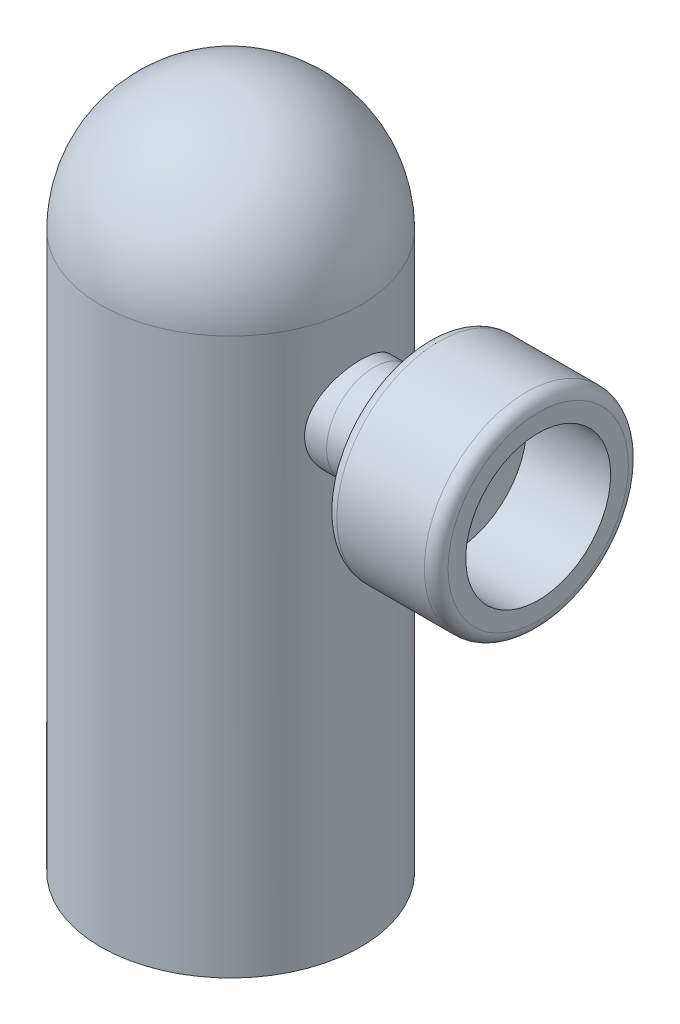
ISO-10303-21;
HEADER;
FILE_DESCRIPTION(('STEP AP214'),'2;1');
FILE_NAME('part.step','',(''),(''),'','','');
FILE_SCHEMA(('AUTOMOTIVE_DESIGN { 1 0 10303 214 1 1 1 1 }'));
ENDSEC;
DATA;
#1=APPLICATION_CONTEXT('core data for automotive mechanical design processes');
#2=APPLICATION_PROTOCOL_DEFINITION('international standard','automotive_design',2000,#1);
#3=PRODUCT_CONTEXT('',#1,'mechanical');
#4=PRODUCT('Part','Part','',(#3));
#5=PRODUCT_RELATED_PRODUCT_CATEGORY('part','',(#4));
#6=PRODUCT_DEFINITION_FORMATION('','',#4);
#7=PRODUCT_DEFINITION_CONTEXT('part definition',#1,'design');
#8=PRODUCT_DEFINITION('design','',#6,#7);
#9=PRODUCT_DEFINITION_SHAPE('','',#8);
#10=(LENGTH_UNIT() NAMED_UNIT(*) SI_UNIT(.MILLI.,.METRE.));
#11=(NAMED_UNIT(*) PLANE_ANGLE_UNIT() SI_UNIT($,.RADIAN.));
#12=(NAMED_UNIT(*) SI_UNIT($,.STERADIAN.) SOLID_ANGLE_UNIT());
#13=UNCERTAINTY_MEASURE_WITH_UNIT(LENGTH_MEASURE(1.E-05),#10,'distance_accuracy_value','');
#14=(GEOMETRIC_REPRESENTATION_CONTEXT(3) GLOBAL_UNCERTAINTY_ASSIGNED_CONTEXT((#13)) GLOBAL_UNIT_ASSIGNED_CONTEXT((#10,
#11,#12)) REPRESENTATION_CONTEXT('',''));
#15=CARTESIAN_POINT('',(0.,0.,0.));
#16=DIRECTION('',(0.,0.,1.));
#17=DIRECTION('',(1.,0.,0.));
#18=AXIS2_PLACEMENT_3D('',#15,#16,#17);
#19=CARTESIAN_POINT('',(-1.59828178671078,-36.159735756104,9.25139099474879E-06));
#20=DIRECTION('',(1.,0.,0.));
#21=DIRECTION('',(0.,0.,-1.));
#22=AXIS2_PLACEMENT_3D('',#19,#20,#21);
#23=CYLINDRICAL_SURFACE('',#22,2.);
#24=CARTESIAN_POINT('',(9.02544359626902,-36.159735756104,-1.99999074860901));
#25=CARTESIAN_POINT('',(9.02544096453205,-36.0514612362852,-1.99999367865149));
#26=CARTESIAN_POINT('',(9.02891319822502,-35.9432066823901,-1.99116882141678));
#27=CARTESIAN_POINT('',(9.04233682666559,-35.7299456158995,-1.95625127237398));
#28=CARTESIAN_POINT('',(9.05228834867055,-35.6249391671411,-1.93015824140777));
#29=CARTESIAN_POINT('',(9.07739742803161,-35.4213082507212,-1.86177531645025));
#30=CARTESIAN_POINT('',(9.09254316473213,-35.3226698914028,-1.81952217365196));
#31=CARTESIAN_POINT('',(9.12631562527031,-35.1338448735134,-1.72014746826749));
#32=CARTESIAN_POINT('',(9.14494332398307,-35.0436605925476,-1.66302173991081));
#33=CARTESIAN_POINT('',(9.18455539693087,-34.8700938195053,-1.53266711334042));
#34=CARTESIAN_POINT('',(9.20560622985162,-34.7871622954869,-1.45885779438741));
#35=CARTESIAN_POINT('',(9.24713626244627,-34.6345392760415,-1.29846469951525));
#36=CARTESIAN_POINT('',(9.2676153486288,-34.5648503935531,-1.21187840851514));
#37=CARTESIAN_POINT('',(9.30647856689912,-34.4385547186546,-1.02500174697023));
#38=CARTESIAN_POINT('',(9.32477562247377,-34.382433108056,-0.924363755704132));
#39=CARTESIAN_POINT('',(9.35641887685477,-34.2881011381408,-0.714293071228156));
#40=CARTESIAN_POINT('',(9.36976668242014,-34.2498849648143,-0.604863246322086));
#41=CARTESIAN_POINT('',(9.38953604534499,-34.1940153816343,-0.385052821943409));
#42=CARTESIAN_POINT('',(9.39621795800662,-34.1755866760156,-0.274893147690441));
#43=CARTESIAN_POINT('',(9.40283413745965,-34.1573363831202,-0.0528557008730374));
#44=CARTESIAN_POINT('',(9.40277046811845,-34.1575091045812,0.0590215357142822));
#45=CARTESIAN_POINT('',(9.39607135857999,-34.1759938048195,0.275781090535129));
#46=CARTESIAN_POINT('',(9.38974206473814,-34.1934607717049,0.380746547048423));
#47=CARTESIAN_POINT('',(9.37161954004395,-34.2446235484749,0.586139819525515));
#48=CARTESIAN_POINT('',(9.35982592543273,-34.2783204981968,0.686567316244933));
#49=CARTESIAN_POINT('',(9.33174186483521,-34.3614068840189,0.881725873136928));
#50=CARTESIAN_POINT('',(9.31538981984212,-34.4110127909624,0.976355542878411));
#51=CARTESIAN_POINT('',(9.27985722791582,-34.5243214723808,1.15617675488492));
#52=CARTESIAN_POINT('',(9.26067580063793,-34.5880286374738,1.24136534511663));
#53=CARTESIAN_POINT('',(9.2202219184951,-34.7318569855978,1.40488040392465));
#54=CARTESIAN_POINT('',(9.19889248909851,-34.8126912727584,1.48256648082462));
#55=CARTESIAN_POINT('',(9.15740819360175,-34.9863851536075,1.62351200406961));
#56=CARTESIAN_POINT('',(9.137253588034,-35.0792474000513,1.68676825940774));
#57=CARTESIAN_POINT('',(9.10005468200638,-35.2767448436178,1.7981826411851));
#58=CARTESIAN_POINT('',(9.08307977448777,-35.3815765477526,1.84601744236544));
#59=CARTESIAN_POINT('',(9.05496277725716,-35.5985856485717,1.92311907025319));
#60=CARTESIAN_POINT('',(9.04381767424903,-35.7107592166074,1.95239549103535));
#61=CARTESIAN_POINT('',(9.02932464743843,-35.9329716053069,1.99013631604282));
#62=CARTESIAN_POINT('',(9.02559853371885,-36.0428139663247,1.99961147144441));
#63=CARTESIAN_POINT('',(9.02529835827174,-36.2625584608963,2.0003821835966));
#64=CARTESIAN_POINT('',(9.02872265831589,-36.3724605749926,1.99168190451323));
#65=CARTESIAN_POINT('',(9.04195529261311,-36.5841933369855,1.9572631014653));
#66=CARTESIAN_POINT('',(9.05147895544497,-36.6861670223672,1.93230262790199));
#67=CARTESIAN_POINT('',(9.07550647275924,-36.8844402466958,1.86701308884863));
#68=CARTESIAN_POINT('',(9.09001131017227,-36.9807386613492,1.8266809899172));
#69=CARTESIAN_POINT('',(9.12300999765838,-37.1687764771693,1.73015553381328));
#70=CARTESIAN_POINT('',(9.1416285783805,-37.2602272458135,1.67344377411477));
#71=CARTESIAN_POINT('',(9.18053842811872,-37.4326752306493,1.54633022607322));
#72=CARTESIAN_POINT('',(9.20083027561306,-37.5136688065631,1.4759236916742));
#73=CARTESIAN_POINT('',(9.24224653133391,-37.6678521461323,1.3185021259436));
#74=CARTESIAN_POINT('',(9.26334948660089,-37.7403002342636,1.2307526075693));
#75=CARTESIAN_POINT('',(9.30285421493331,-37.8695203319574,1.04382147881869));
#76=CARTESIAN_POINT('',(9.3212560152346,-37.926292499586,0.944639983729444));
#77=CARTESIAN_POINT('',(9.35324735767971,-38.0221217945843,0.737869117248849));
#78=CARTESIAN_POINT('',(9.36685854882426,-38.061258846937,0.630320324093581));
#79=CARTESIAN_POINT('',(9.38781677729794,-38.1206836922028,0.409562389942498));
#80=CARTESIAN_POINT('',(9.39516656133552,-38.1409797504965,0.296355753984661));
#81=CARTESIAN_POINT('',(9.40252834299886,-38.1612955849353,0.0742205607269523));
#82=CARTESIAN_POINT('',(9.4029226634429,-38.1623718627876,-0.0345996140534596));
#83=CARTESIAN_POINT('',(9.39731022999128,-38.1469036529602,-0.250800897959177));
#84=CARTESIAN_POINT('',(9.39130417196225,-38.1303610808503,-0.358182162241609));
#85=CARTESIAN_POINT('',(9.37373141203979,-38.0808575107815,-0.566088210233117));
#86=CARTESIAN_POINT('',(9.36228896065557,-38.048262808853,-0.666711498293612));
#87=CARTESIAN_POINT('',(9.33503077395697,-37.9679369721157,-0.86107892324665));
#88=CARTESIAN_POINT('',(9.31921421495113,-37.9202029861683,-0.954821760264947));
#89=CARTESIAN_POINT('',(9.28400090030291,-37.8087295215589,-1.13695179892425));
#90=CARTESIAN_POINT('',(9.2644843820413,-37.7444163756923,-1.22496433194161));
#91=CARTESIAN_POINT('',(9.2242837272392,-37.6025339694667,-1.38928033515262));
#92=CARTESIAN_POINT('',(9.20359918654163,-37.5249601015995,-1.46557971800143));
#93=CARTESIAN_POINT('',(9.16216542167253,-37.3542436001507,-1.60812895309602));
#94=CARTESIAN_POINT('',(9.14146243461795,-37.2605253978944,-1.6737054805196));
#95=CARTESIAN_POINT('',(9.10350849420788,-37.0627428797918,-1.78818279226437));
#96=CARTESIAN_POINT('',(9.08625751317846,-36.9586786468972,-1.83708371027234));
#97=CARTESIAN_POINT('',(9.05716362177555,-36.7409909686416,-1.91723624418185));
#98=CARTESIAN_POINT('',(9.045425443074,-36.6272274523344,-1.94814854391979));
#99=CARTESIAN_POINT('',(9.02956897672621,-36.3955450909424,-1.98951852707077));
#100=CARTESIAN_POINT('',(9.02544646179016,-36.2776285881575,-1.99998755828309));
#101=CARTESIAN_POINT('',(9.02544359626902,-36.159735756104,-1.99999074860901));
#102=B_SPLINE_CURVE_WITH_KNOTS('',3,(#24,#25,#26,#27,#28,#29,#30,#31,#32,#33,#34,#35,#36,#37,
#38,#39,#40,#41,#42,#43,#44,#45,#46,#47,#48,#49,#50,#51,#52,#53,#54,#55,#56,#57,#58,#59,#60,#61,
#62,#63,#64,#65,#66,#67,#68,#69,#70,#71,#72,#73,#74,#75,#76,#77,#78,#79,#80,#81,#82,#83,#84,#85,
#86,#87,#88,#89,#90,#91,#92,#93,#94,#95,#96,#97,#98,#99,#100,#101),.UNSPECIFIED.,.T.,.F.,(4,2,2,
2,2,2,2,2,2,2,2,2,2,2,2,2,2,2,2,2,2,2,2,2,2,2,2,2,2,2,2,2,2,2,2,2,2,2,4),(0.,0.324385235377267,
0.648776842079719,0.972435065073583,1.29618404156545,1.63366988764055,1.97122225489985,
2.31948370902438,2.66763200192577,3.00157681867777,3.33541946250727,3.65371703874088,
3.97203697238109,4.2948863859802,4.61783646488796,4.95865365420964,5.29954613884792,
5.64718022486076,5.99463444855926,6.32387056541214,6.6530312593916,6.96784950829476,
7.28272991572498,7.60893794143316,7.93525921974557,8.28082051863008,8.62637833296747,
8.97035387486193,9.31417844625912,9.63904117518342,9.96386858774743,10.2816050472769,
10.5994013807848,10.9301665077848,11.26104679535,11.6080968285023,11.9551440793218,
12.3085415361896,12.6617427707823),.UNSPECIFIED.);
#103=CARTESIAN_POINT('',(9.02544359626902,-36.159735756104,-1.99999074860901));
#104=VERTEX_POINT('',#103);
#105=EDGE_CURVE('E59',#104,#104,#102,.T.);
#106=ORIENTED_EDGE('',*,*,#105,.T.);
#107=EDGE_LOOP('',(#106));
#108=FACE_BOUND('',#107,.T.);
#109=CARTESIAN_POINT('',(9.95724308419695,-36.159735756104,9.25139099474879E-06));
#110=DIRECTION('',(-1.,0.,0.));
#111=DIRECTION('',(0.,0.,1.));
#112=AXIS2_PLACEMENT_3D('',#109,#110,#111);
#113=CIRCLE('',#112,2.);
#114=CARTESIAN_POINT('',(9.95724308419695,-36.159735756104,2.000009251391));
#115=VERTEX_POINT('',#114);
#116=EDGE_CURVE('E92',#115,#115,#113,.T.);
#117=ORIENTED_EDGE('',*,*,#116,.T.);
#118=EDGE_LOOP('',(#117));
#119=FACE_BOUND('',#118,.T.);
#120=ADVANCED_FACE('F39',(#108,#119),#23,.T.);
#121=CARTESIAN_POINT('',(3.90196821328923,-32.159735756104,9.25139099474879E-06));
#122=DIRECTION('',(0.,1.,0.));
#123=DIRECTION('',(0.,0.,1.));
#124=AXIS2_PLACEMENT_3D('',#121,#122,#123);
#125=CYLINDRICAL_SURFACE('',#124,5.5);
#126=ORIENTED_EDGE('',*,*,#105,.F.);
#127=EDGE_LOOP('',(#126));
#128=FACE_BOUND('',#127,.T.);
#129=CARTESIAN_POINT('',(3.90196821328923,-55.659735756104,9.25139099474879E-06));
#130=DIRECTION('',(0.,1.,0.));
#131=DIRECTION('',(0.,0.,1.));
#132=AXIS2_PLACEMENT_3D('',#129,#130,#131);
#133=CIRCLE('',#132,5.5);
#134=CARTESIAN_POINT('',(3.90196821328923,-55.659735756104,5.50000925139099));
#135=VERTEX_POINT('',#134);
#136=EDGE_CURVE('E112',#135,#135,#133,.F.);
#137=ORIENTED_EDGE('',*,*,#136,.F.);
#138=EDGE_LOOP('',(#137));
#139=FACE_BOUND('',#138,.T.);
#140=CARTESIAN_POINT('',(3.90196821328923,-32.159735756104,9.25139099474879E-06));
#141=DIRECTION('',(0.,1.,0.));
#142=DIRECTION('',(0.,0.,1.));
#143=AXIS2_PLACEMENT_3D('',#140,#141,#142);
#144=CIRCLE('',#143,5.5);
#145=CARTESIAN_POINT('',(3.90196821328923,-32.159735756104,5.50000925139099));
#146=VERTEX_POINT('',#145);
#147=EDGE_CURVE('E67',#146,#146,#144,.T.);
#148=ORIENTED_EDGE('',*,*,#147,.F.);
#149=EDGE_LOOP('',(#148));
#150=FACE_BOUND('',#149,.T.);
#151=ADVANCED_FACE('F69',(#128,#139,#150),#125,.T.);
#152=CARTESIAN_POINT('',(3.90196821328923,-32.159735756104,9.25139099474879E-06));
#153=DIRECTION('',(0.,1.,0.));
#154=DIRECTION('',(1.,0.,0.));
#155=AXIS2_PLACEMENT_3D('',#152,#153,#154);
#156=SPHERICAL_SURFACE('',#155,5.5);
#157=ORIENTED_EDGE('',*,*,#147,.T.);
#158=EDGE_LOOP('',(#157));
#159=FACE_BOUND('',#158,.T.);
#160=ADVANCED_FACE('F78',(#159),#156,.T.);
#161=CARTESIAN_POINT('',(36.9019682132892,-36.159735756104,9.25139099474879E-06));
#162=DIRECTION('',(-1.,0.,0.));
#163=DIRECTION('',(0.,0.,-1.));
#164=AXIS2_PLACEMENT_3D('',#161,#162,#163);
#165=SPHERICAL_SURFACE('',#164,25.);
#166=CARTESIAN_POINT('',(12.2065127958721,-36.159735756104,9.25139099474879E-06));
#167=DIRECTION('',(1.,0.,0.));
#168=DIRECTION('',(0.,0.,-1.));
#169=AXIS2_PLACEMENT_3D('',#166,#167,#168);
#170=CIRCLE('',#169,3.89030612244898);
#171=CARTESIAN_POINT('',(12.2065127958721,-36.159735756104,-3.89029687105796));
#172=VERTEX_POINT('',#171);
#173=EDGE_CURVE('E10',#172,#172,#170,.F.);
#174=CARTESIAN_POINT('',(11.9820899371434,-36.159735756104,9.25139099474879E-06));
#175=DIRECTION('',(-1.,0.,0.));
#176=DIRECTION('',(0.,0.,1.));
#177=AXIS2_PLACEMENT_3D('',#174,#175,#176);
#178=CIRCLE('',#177,1.99991667378331);
#179=CARTESIAN_POINT('',(11.9820899371434,-36.159735756104,-1.99990742239234));
#180=VERTEX_POINT('',#179);
#181=EDGE_CURVE('E94',#180,#180,#178,.T.);
#182=CARTESIAN_POINT('',(12.2065127958721,-36.159735756104,-3.89029687105796));
#183=CARTESIAN_POINT('',(12.2034262844114,-36.159735756104,-3.87070386151764));
#184=CARTESIAN_POINT('',(12.2003630902505,-36.159735756104,-3.85110717877399));
#185=CARTESIAN_POINT('',(12.1942833536731,-36.159735756104,-3.81190657793028));
#186=CARTESIAN_POINT('',(12.1912668112567,-36.159735756104,-3.79230265983023));
#187=CARTESIAN_POINT('',(12.1852803953132,-36.159735756104,-3.75308769932395));
#188=CARTESIAN_POINT('',(12.1823105217862,-36.159735756104,-3.73347665691774));
#189=CARTESIAN_POINT('',(12.1764174604315,-36.159735756104,-3.69424755890074));
#190=CARTESIAN_POINT('',(12.1734942726038,-36.159735756104,-3.67462950328995));
#191=CARTESIAN_POINT('',(12.1676945992118,-36.159735756104,-3.63538649000218));
#192=CARTESIAN_POINT('',(12.1648181136475,-36.159735756104,-3.61576153232521));
#193=CARTESIAN_POINT('',(12.1591118610772,-36.159735756104,-3.57650482608333));
#194=CARTESIAN_POINT('',(12.156282094071,-36.159735756104,-3.55687307751843));
#195=CARTESIAN_POINT('',(12.1506692946483,-36.159735756104,-3.51760290071723));
#196=CARTESIAN_POINT('',(12.1478862622316,-36.159735756104,-3.49796447248094));
#197=CARTESIAN_POINT('',(12.1423669477538,-36.159735756104,-3.45868104759138));
#198=CARTESIAN_POINT('',(12.1396306656928,-36.159735756104,-3.43903605093811));
#199=CARTESIAN_POINT('',(12.1342048674277,-36.159735756104,-3.39973960050624));
#200=CARTESIAN_POINT('',(12.1315153512237,-36.159735756104,-3.38008814672763));
#201=CARTESIAN_POINT('',(12.1261830999093,-36.159735756104,-3.34077889337327));
#202=CARTESIAN_POINT('',(12.1235403647988,-36.159735756104,-3.32112109379752));
#203=CARTESIAN_POINT('',(12.1183016906429,-36.159735756104,-3.28179926021303));
#204=CARTESIAN_POINT('',(12.1157057515975,-36.159735756104,-3.2621352262043));
#205=CARTESIAN_POINT('',(12.1105606842779,-36.159735756104,-3.22280103515332));
#206=CARTESIAN_POINT('',(12.1080115560038,-36.159735756104,-3.20313087811108));
#207=CARTESIAN_POINT('',(12.1029601246681,-36.159735756104,-3.16378455242724));
#208=CARTESIAN_POINT('',(12.1004578216065,-36.159735756104,-3.14410838378565));
#209=CARTESIAN_POINT('',(12.0955000548717,-36.159735756104,-3.10475014637134));
#210=CARTESIAN_POINT('',(12.0930445911985,-36.159735756104,-3.08506807759862));
#211=CARTESIAN_POINT('',(12.0881805171511,-36.159735756104,-3.0456981514237));
#212=CARTESIAN_POINT('',(12.0857719067769,-36.159735756104,-3.02601029402149));
#213=CARTESIAN_POINT('',(12.0810015529725,-36.159735756104,-2.98662890212204));
#214=CARTESIAN_POINT('',(12.0786398095423,-36.159735756104,-2.96693536762479));
#215=CARTESIAN_POINT('',(12.0739632030056,-36.159735756104,-2.92754273310183));
#216=CARTESIAN_POINT('',(12.0716483398991,-36.159735756104,-2.90784363307613));
#217=CARTESIAN_POINT('',(12.0670655071238,-36.159735756104,-2.86843997909441));
#218=CARTESIAN_POINT('',(12.064797537455,-36.159735756104,-2.84873542513839));
#219=CARTESIAN_POINT('',(12.0603085044034,-36.159735756104,-2.80932097492506));
#220=CARTESIAN_POINT('',(12.0580874410206,-36.159735756104,-2.78961107866774));
#221=CARTESIAN_POINT('',(12.0536922331237,-36.159735756104,-2.75018605551111));
#222=CARTESIAN_POINT('',(12.0515180886096,-36.159735756104,-2.73047092861179));
#223=CARTESIAN_POINT('',(12.0472167307669,-36.159735756104,-2.69103555586007));
#224=CARTESIAN_POINT('',(12.0450895174384,-36.159735756104,-2.67131531000767));
#225=CARTESIAN_POINT('',(12.0408820340177,-36.159735756104,-2.63186981106772));
#226=CARTESIAN_POINT('',(12.0388017639255,-36.159735756104,-2.61214455798016));
#227=CARTESIAN_POINT('',(12.0346881787628,-36.159735756104,-2.57268915631617));
#228=CARTESIAN_POINT('',(12.0326548636922,-36.159735756104,-2.55295900773974));
#229=CARTESIAN_POINT('',(12.0286352000914,-36.159735756104,-2.51349392687204));
#230=CARTESIAN_POINT('',(12.0266488515612,-36.159735756104,-2.49375899458076));
#231=CARTESIAN_POINT('',(12.0227231322944,-36.159735756104,-2.45428445808449));
#232=CARTESIAN_POINT('',(12.0207837615577,-36.159735756104,-2.43454485387949));
#233=CARTESIAN_POINT('',(12.0169520088645,-36.159735756104,-2.39506108538336));
#234=CARTESIAN_POINT('',(12.015059626908,-36.159735756104,-2.37531692109223));
#235=CARTESIAN_POINT('',(12.011321862496,-36.159735756104,-2.33582414427725));
#236=CARTESIAN_POINT('',(12.0094764800404,-36.159735756104,-2.3160755317534));
#237=CARTESIAN_POINT('',(12.0058327250842,-36.159735756104,-2.27657397035164));
#238=CARTESIAN_POINT('',(12.0040343525836,-36.159735756104,-2.25682102147373));
#239=CARTESIAN_POINT('',(12.0004846277265,-36.159735756104,-2.21731089926693));
#240=CARTESIAN_POINT('',(11.99873327537,-36.159735756104,-2.19755372593804));
#241=CARTESIAN_POINT('',(11.9952776007186,-36.159735756104,-2.15803526675677));
#242=CARTESIAN_POINT('',(11.9935732784237,-36.159735756104,-2.13827398090438));
#243=CARTESIAN_POINT('',(11.990211673566,-36.159735756104,-2.09874740862525));
#244=CARTESIAN_POINT('',(11.9885543910032,-36.159735756104,-2.07898212219851));
#245=CARTESIAN_POINT('',(11.9852868749419,-36.159735756104,-2.03944766074844));
#246=CARTESIAN_POINT('',(11.9836766414435,-36.159735756104,-2.01967848572511));
#247=CARTESIAN_POINT('',(11.9820899371434,-36.159735756104,-1.99990742239234));
#248=B_SPLINE_CURVE_WITH_KNOTS('',3,(#182,#183,#184,#185,#186,#187,#188,#189,#190,#191,#192,
#193,#194,#195,#196,#197,#198,#199,#200,#201,#202,#203,#204,#205,#206,#207,#208,#209,#210,#211,
#212,#213,#214,#215,#216,#217,#218,#219,#220,#221,#222,#223,#224,#225,#226,#227,#228,#229,#230,
#231,#232,#233,#234,#235,#236,#237,#238,#239,#240,#241,#242,#243,#244,#245,#246,#247),
.UNSPECIFIED.,.F.,.F.,(4,2,2,2,2,2,2,2,2,2,2,2,2,2,2,2,2,2,2,2,2,2,2,2,2,2,2,2,2,2,2,2,4),(0.,
0.0595038781173406,0.119007756234681,0.178511634352017,0.238015512469358,0.297519390586698,
0.357023268704034,0.416527146821375,0.476031024938715,0.535534903056057,0.595038781173397,
0.654542659290733,0.714046537408073,0.773550415525414,0.833054293642749,0.89255817176009,
0.952062049877431,1.01156592799477,1.07106980611211,1.13057368422945,1.19007756234679,
1.24958144046413,1.30908531858146,1.36858919669881,1.42809307481615,1.48759695293349,
1.54710083105083,1.60660470916816,1.6661085872855,1.72561246540284,1.78511634352018,
1.84462022163752,1.90412409975486),.UNSPECIFIED.);
#249=EDGE_CURVE('BSEAM80',#172,#180,#248,.T.);
#250=ORIENTED_EDGE('',*,*,#173,.T.);
#251=ORIENTED_EDGE('',*,*,#181,.F.);
#252=ORIENTED_EDGE('',*,*,#249,.T.);
#253=ORIENTED_EDGE('',*,*,#249,.F.);
#254=EDGE_LOOP('',(#250,#252,#251,#253));
#255=FACE_BOUND('',#254,.T.);
#256=ADVANCED_FACE('F80',(#255),#165,.T.);
#257=CARTESIAN_POINT('',(9.95724308419695,-36.159735756104,9.25139099474879E-06));
#258=DIRECTION('',(-1.,0.,0.));
#259=DIRECTION('',(0.,0.,1.));
#260=AXIS2_PLACEMENT_3D('',#257,#258,#259);
#261=CONICAL_SURFACE('',#260,2.,4.11518611973048E-05);
#262=ORIENTED_EDGE('',*,*,#181,.T.);
#263=EDGE_LOOP('',(#262));
#264=FACE_BOUND('',#263,.T.);
#265=ORIENTED_EDGE('',*,*,#116,.F.);
#266=EDGE_LOOP('',(#265));
#267=FACE_BOUND('',#266,.T.);
#268=ADVANCED_FACE('F85',(#264,#267),#261,.T.);
#269=CARTESIAN_POINT('',(16.9019682132892,-36.159735756104,9.25139099474879E-06));
#270=DIRECTION('',(1.,0.,0.));
#271=DIRECTION('',(0.,0.,-1.));
#272=AXIS2_PLACEMENT_3D('',#269,#270,#271);
#273=PLANE('',#272);
#274=CARTESIAN_POINT('',(16.9019682132892,-36.159735756104,9.25139099474879E-06));
#275=DIRECTION('',(1.,0.,0.));
#276=DIRECTION('',(0.,0.,-1.));
#277=AXIS2_PLACEMENT_3D('',#274,#275,#276);
#278=CIRCLE('',#277,3.8125);
#279=CARTESIAN_POINT('',(16.9019682132892,-36.159735756104,-3.812490748609));
#280=VERTEX_POINT('',#279);
#281=EDGE_CURVE('E54',#280,#280,#278,.T.);
#282=ORIENTED_EDGE('',*,*,#281,.T.);
#283=EDGE_LOOP('',(#282));
#284=FACE_BOUND('',#283,.T.);
#285=CARTESIAN_POINT('',(16.9019682132892,-36.159735756104,9.25139099474879E-06));
#286=DIRECTION('',(1.,0.,0.));
#287=DIRECTION('',(0.,0.,-1.));
#288=AXIS2_PLACEMENT_3D('',#285,#286,#287);
#289=CIRCLE('',#288,3.0625);
#290=CARTESIAN_POINT('',(16.9019682132892,-36.159735756104,-3.062490748609));
#291=VERTEX_POINT('',#290);
#292=EDGE_CURVE('E101',#291,#291,#289,.T.);
#293=ORIENTED_EDGE('',*,*,#292,.F.);
#294=EDGE_LOOP('',(#293));
#295=FACE_BOUND('',#294,.T.);
#296=ADVANCED_FACE('F76',(#284,#295),#273,.T.);
#297=CARTESIAN_POINT('',(11.9019682132892,-36.159735756104,9.25139099474879E-06));
#298=DIRECTION('',(1.,0.,0.));
#299=DIRECTION('',(0.,0.,-1.));
#300=AXIS2_PLACEMENT_3D('',#297,#298,#299);
#301=CYLINDRICAL_SURFACE('',#300,4.3125);
#302=CARTESIAN_POINT('',(16.4019682132892,-36.159735756104,9.25139099474879E-06));
#303=DIRECTION('',(1.,0.,0.));
#304=DIRECTION('',(0.,0.,-1.));
#305=AXIS2_PLACEMENT_3D('',#302,#303,#304);
#306=CIRCLE('',#305,4.3125);
#307=CARTESIAN_POINT('',(16.4019682132892,-36.159735756104,-4.31249074860901));
#308=VERTEX_POINT('',#307);
#309=EDGE_CURVE('E46',#308,#308,#306,.F.);
#310=ORIENTED_EDGE('',*,*,#309,.T.);
#311=EDGE_LOOP('',(#310));
#312=FACE_BOUND('',#311,.T.);
#313=CARTESIAN_POINT('',(12.7004219042205,-36.159735756104,9.25139099474879E-06));
#314=DIRECTION('',(1.,0.,0.));
#315=DIRECTION('',(0.,0.,-1.));
#316=AXIS2_PLACEMENT_3D('',#313,#314,#315);
#317=CIRCLE('',#316,4.3125);
#318=CARTESIAN_POINT('',(12.7004219042205,-36.159735756104,-4.31249074860901));
#319=VERTEX_POINT('',#318);
#320=EDGE_CURVE('E50',#319,#319,#317,.T.);
#321=ORIENTED_EDGE('',*,*,#320,.T.);
#322=EDGE_LOOP('',(#321));
#323=FACE_BOUND('',#322,.T.);
#324=ADVANCED_FACE('F132',(#312,#323),#301,.T.);
#325=CARTESIAN_POINT('',(-1.59828178671078,-36.159735756104,9.25139099474879E-06));
#326=DIRECTION('',(1.,0.,0.));
#327=DIRECTION('',(0.,0.,-1.));
#328=AXIS2_PLACEMENT_3D('',#325,#326,#327);
#329=CYLINDRICAL_SURFACE('',#328,0.75);
#330=CARTESIAN_POINT('',(8.0875058897132,-36.0228940929856,0.737419828502168));
#331=CARTESIAN_POINT('',(8.08617049069679,-36.0637630064586,0.745002311439409));
#332=CARTESIAN_POINT('',(8.08541592996124,-36.1053024757912,0.749186432587772));
#333=CARTESIAN_POINT('',(8.08516005919782,-36.1885261461659,0.750612869235716));
#334=CARTESIAN_POINT('',(8.08565970569716,-36.230210433446,0.747849886490226));
#335=CARTESIAN_POINT('',(8.08785449428569,-36.3124921371854,0.735464910209451));
#336=CARTESIAN_POINT('',(8.08954897652322,-36.3530901407095,0.725846702461315));
#337=CARTESIAN_POINT('',(8.09393844028719,-36.432079553366,0.700048794785175));
#338=CARTESIAN_POINT('',(8.09663333448669,-36.4704711547596,0.683869667554721));
#339=CARTESIAN_POINT('',(8.10273859920565,-36.5442250838219,0.645307455969319));
#340=CARTESIAN_POINT('',(8.10615306650534,-36.5795683587346,0.622888601641697));
#341=CARTESIAN_POINT('',(8.1133081143654,-36.646025048822,0.5725139862104));
#342=CARTESIAN_POINT('',(8.1170487280648,-36.6771380333421,0.544557662088423));
#343=CARTESIAN_POINT('',(8.12449546944613,-36.7346819068821,0.483456568329141));
#344=CARTESIAN_POINT('',(8.12820046898483,-36.76104470004,0.450247479252683));
#345=CARTESIAN_POINT('',(8.13510957386116,-36.8078274601003,0.379830070193575));
#346=CARTESIAN_POINT('',(8.13831368298093,-36.8282474718766,0.342621780411706));
#347=CARTESIAN_POINT('',(8.14385749069828,-36.8625243078488,0.265291104518615));
#348=CARTESIAN_POINT('',(8.14619830673657,-36.8763896230018,0.225172566526637));
#349=CARTESIAN_POINT('',(8.14975608330511,-36.8971689193863,0.143126954961102));
#350=CARTESIAN_POINT('',(8.15097315388046,-36.9040835812807,0.1012000588957));
#351=CARTESIAN_POINT('',(8.15213695663558,-36.9106983704242,0.0173385544880691));
#352=CARTESIAN_POINT('',(8.15210073022742,-36.9104952791583,-0.0245882035203375));
#353=CARTESIAN_POINT('',(8.15080431136008,-36.9031206433716,-0.107803569388967));
#354=CARTESIAN_POINT('',(8.14954415442295,-36.8959493010898,-0.149092195734309));
#355=CARTESIAN_POINT('',(8.14594875062602,-36.8749116970614,-0.229661789870595));
#356=CARTESIAN_POINT('',(8.14361870526031,-36.861077810989,-0.268951460954375));
#357=CARTESIAN_POINT('',(8.13813934152594,-36.8271374403959,-0.344659058155517));
#358=CARTESIAN_POINT('',(8.13498996517725,-36.8070305119428,-0.381076780801427));
#359=CARTESIAN_POINT('',(8.12817384519292,-36.7608511728162,-0.450452825303774));
#360=CARTESIAN_POINT('',(8.12450168929018,-36.7347143128111,-0.483367711000221));
#361=CARTESIAN_POINT('',(8.11707085663167,-36.6773244886432,-0.544376754271836));
#362=CARTESIAN_POINT('',(8.11331217350623,-36.6460711467902,-0.572470555648775));
#363=CARTESIAN_POINT('',(8.10608692331406,-36.5789455200619,-0.623332063382899));
#364=CARTESIAN_POINT('',(8.10262377895665,-36.5430288128391,-0.646041688383796));
#365=CARTESIAN_POINT('',(8.09643121470936,-36.46782953292,-0.685098794988301));
#366=CARTESIAN_POINT('',(8.09370175803147,-36.4285471291141,-0.701446595600091));
#367=CARTESIAN_POINT('',(8.08931085483603,-36.3479996803851,-0.727199401777089));
#368=CARTESIAN_POINT('',(8.08764241394987,-36.3067495882892,-0.736649937457));
#369=CARTESIAN_POINT('',(8.0855418209457,-36.2232186513091,-0.74848849686423));
#370=CARTESIAN_POINT('',(8.08510955135944,-36.1809379047488,-0.75087719164993));
#371=CARTESIAN_POINT('',(8.08552943075812,-36.0971577564358,-0.748533650387155));
#372=CARTESIAN_POINT('',(8.08636422796896,-36.0556555381399,-0.743897615563331));
#373=CARTESIAN_POINT('',(8.0891894358523,-35.9740312898749,-0.727825991132464));
#374=CARTESIAN_POINT('',(8.0911798580492,-35.9339092736741,-0.716390333716536));
#375=CARTESIAN_POINT('',(8.096091289531,-35.8561275885372,-0.687050800648254));
#376=CARTESIAN_POINT('',(8.09901312253391,-35.818470134869,-0.669141197704072));
#377=CARTESIAN_POINT('',(8.10545975197926,-35.7466721308671,-0.627369276428343));
#378=CARTESIAN_POINT('',(8.10898460232367,-35.7125318953647,-0.60350642586585));
#379=CARTESIAN_POINT('',(8.11630105604715,-35.6482305213133,-0.550111582973371));
#380=CARTESIAN_POINT('',(8.1200956911915,-35.6181314326599,-0.520505253681482));
#381=CARTESIAN_POINT('',(8.12748468124766,-35.5633053331606,-0.456654280549859));
#382=CARTESIAN_POINT('',(8.13107902861647,-35.5385785245373,-0.422409462187507));
#383=CARTESIAN_POINT('',(8.13768614888176,-35.4950758100626,-0.350018948935772));
#384=CARTESIAN_POINT('',(8.14069567217348,-35.4763328031308,-0.311853163469499));
#385=CARTESIAN_POINT('',(8.14576850348179,-35.4455418382965,-0.232851186987914));
#386=CARTESIAN_POINT('',(8.14783188660269,-35.4334933489692,-0.192015208225861));
#387=CARTESIAN_POINT('',(8.15076090586539,-35.4165610102146,-0.109318998615607));
#388=CARTESIAN_POINT('',(8.15163968990918,-35.4115984762829,-0.0674753483312104));
#389=CARTESIAN_POINT('',(8.1521435238186,-35.4087414856683,0.0164586176401284));
#390=CARTESIAN_POINT('',(8.15176865727522,-35.4108465577313,0.0585489166942012));
#391=CARTESIAN_POINT('',(8.14981781364608,-35.4219991458382,0.141329245381849));
#392=CARTESIAN_POINT('',(8.14825415094257,-35.4309754909365,0.182029189450143));
#393=CARTESIAN_POINT('',(8.14411221700509,-35.4555121172466,0.261336954367367));
#394=CARTESIAN_POINT('',(8.14153393152115,-35.4710724909285,0.299944745824185));
#395=CARTESIAN_POINT('',(8.13562441158474,-35.5084401999858,0.374247641374666));
#396=CARTESIAN_POINT('',(8.13228857661945,-35.530285931542,0.409923055213416));
#397=CARTESIAN_POINT('',(8.12523605204026,-35.5795767639991,0.477139139153438));
#398=CARTESIAN_POINT('',(8.12151926199036,-35.6070233434222,0.508678713849588));
#399=CARTESIAN_POINT('',(8.11405942751066,-35.6671772094493,0.567169217138436));
#400=CARTESIAN_POINT('',(8.11031672126676,-35.6999514321904,0.594051342389826));
#401=CARTESIAN_POINT('',(8.10328182051803,-35.769568968699,0.641921493049692));
#402=CARTESIAN_POINT('',(8.09998923515882,-35.8064087013607,0.662914648920215));
#403=CARTESIAN_POINT('',(8.09498205626536,-35.8730906458958,0.693774912506843));
#404=CARTESIAN_POINT('',(8.09307993292548,-35.9022468952291,0.705115880695179));
#405=CARTESIAN_POINT('',(8.08984423811983,-35.9617736093596,0.7240857382971));
#406=CARTESIAN_POINT('',(8.0885106530008,-35.9921440449795,0.731714716853442));
#407=CARTESIAN_POINT('',(8.0875058897132,-36.0228940929856,0.737419828502168));
#408=B_SPLINE_CURVE_WITH_KNOTS('',3,(#330,#331,#332,#333,#334,#335,#336,#337,#338,#339,#340,
#341,#342,#343,#344,#345,#346,#347,#348,#349,#350,#351,#352,#353,#354,#355,#356,#357,#358,#359,
#360,#361,#362,#363,#364,#365,#366,#367,#368,#369,#370,#371,#372,#373,#374,#375,#376,#377,#378,
#379,#380,#381,#382,#383,#384,#385,#386,#387,#388,#389,#390,#391,#392,#393,#394,#395,#396,#397,
#398,#399,#400,#401,#402,#403,#404,#405,#406,#407),.UNSPECIFIED.,.T.,.F.,(4,2,2,2,2,2,2,2,2,2,2,
2,2,2,2,2,2,2,2,2,2,2,2,2,2,2,2,2,2,2,2,2,2,2,2,2,2,2,4),(0.,0.124650460131038,
0.249396014417419,0.374072731494382,0.49873856797963,0.62413433207369,0.749542852243377,
0.876626596456872,1.00370938103895,1.13062708834217,1.25753236564978,1.38271276517809,
1.50788953171289,1.63246406485201,1.75704741591821,1.88302967329127,2.00902123466148,
2.13631567393708,2.26360372932035,2.39004373932131,2.5164717338496,2.64118392025601,
2.76589735036913,2.89072138155613,3.01555657623555,3.14213063241823,3.26870945225877,
3.39597267327335,3.5232257904227,3.64905456040477,3.77487494053637,3.89940944905185,
4.02394570666722,4.14925950309661,4.27460642298736,4.40167103765026,4.5286246075452,
4.62241471261569,4.71620256522263),.UNSPECIFIED.);
#409=CARTESIAN_POINT('',(8.0875058897132,-36.0228940929856,0.737419828502168));
#410=VERTEX_POINT('',#409);
#411=EDGE_CURVE('E98',#410,#410,#408,.T.);
#412=ORIENTED_EDGE('',*,*,#411,.F.);
#413=EDGE_LOOP('',(#412));
#414=FACE_BOUND('',#413,.T.);
#415=CARTESIAN_POINT('',(9.957217364282,-36.159735756104,9.25139099474879E-06));
#416=DIRECTION('',(-1.,0.,0.));
#417=DIRECTION('',(0.,0.,1.));
#418=AXIS2_PLACEMENT_3D('',#415,#416,#417);
#419=CIRCLE('',#418,0.75);
#420=CARTESIAN_POINT('',(9.957217364282,-36.159735756104,0.750009251390995));
#421=VERTEX_POINT('',#420);
#422=EDGE_CURVE('E108',#421,#421,#419,.T.);
#423=ORIENTED_EDGE('',*,*,#422,.F.);
#424=EDGE_LOOP('',(#423));
#425=FACE_BOUND('',#424,.T.);
#426=ADVANCED_FACE('F128',(#414,#425),#329,.F.);
#427=CARTESIAN_POINT('',(3.90196821328923,-32.159735756104,9.25139099474879E-06));
#428=DIRECTION('',(0.,1.,0.));
#429=DIRECTION('',(0.,0.,1.));
#430=AXIS2_PLACEMENT_3D('',#427,#428,#429);
#431=CYLINDRICAL_SURFACE('',#430,4.25);
#432=ORIENTED_EDGE('',*,*,#411,.T.);
#433=EDGE_LOOP('',(#432));
#434=FACE_BOUND('',#433,.T.);
#435=CARTESIAN_POINT('',(3.90196821328923,-55.659735756104,9.25139099474879E-06));
#436=DIRECTION('',(0.,1.,0.));
#437=DIRECTION('',(0.,0.,1.));
#438=AXIS2_PLACEMENT_3D('',#435,#436,#437);
#439=CIRCLE('',#438,4.25);
#440=CARTESIAN_POINT('',(3.90196821328923,-55.659735756104,4.25000925139099));
#441=VERTEX_POINT('',#440);
#442=EDGE_CURVE('E278',#441,#441,#439,.F.);
#443=ORIENTED_EDGE('',*,*,#442,.T.);
#444=EDGE_LOOP('',(#443));
#445=FACE_BOUND('',#444,.T.);
#446=CARTESIAN_POINT('',(3.90196821328923,-32.159735756104,9.25139099474879E-06));
#447=DIRECTION('',(0.,1.,0.));
#448=DIRECTION('',(0.,0.,1.));
#449=AXIS2_PLACEMENT_3D('',#446,#447,#448);
#450=CIRCLE('',#449,4.25);
#451=CARTESIAN_POINT('',(3.90196821328923,-32.159735756104,4.25000925139099));
#452=VERTEX_POINT('',#451);
#453=EDGE_CURVE('E104',#452,#452,#450,.T.);
#454=ORIENTED_EDGE('',*,*,#453,.T.);
#455=EDGE_LOOP('',(#454));
#456=FACE_BOUND('',#455,.T.);
#457=ADVANCED_FACE('F125',(#434,#445,#456),#431,.F.);
#458=CARTESIAN_POINT('',(3.90196821328923,-32.159735756104,9.25139099474879E-06));
#459=DIRECTION('',(0.,1.,0.));
#460=DIRECTION('',(1.,0.,0.));
#461=AXIS2_PLACEMENT_3D('',#458,#459,#460);
#462=SPHERICAL_SURFACE('',#461,4.25);
#463=ORIENTED_EDGE('',*,*,#453,.F.);
#464=EDGE_LOOP('',(#463));
#465=FACE_BOUND('',#464,.T.);
#466=ADVANCED_FACE('F134',(#465),#462,.F.);
#467=CARTESIAN_POINT('',(36.9019682132892,-36.159735756104,9.25139099474879E-06));
#468=DIRECTION('',(-1.,0.,0.));
#469=DIRECTION('',(0.,0.,-1.));
#470=AXIS2_PLACEMENT_3D('',#467,#468,#469);
#471=SPHERICAL_SURFACE('',#470,23.75);
#472=CARTESIAN_POINT('',(13.3502465405537,-36.159735756104,9.25139099474879E-06));
#473=DIRECTION('',(1.,0.,0.));
#474=DIRECTION('',(0.,0.,-1.));
#475=AXIS2_PLACEMENT_3D('',#472,#473,#474);
#476=CIRCLE('',#475,3.0625);
#477=CARTESIAN_POINT('',(13.3502465405537,-36.159735756104,-3.06249074860898));
#478=VERTEX_POINT('',#477);
#479=EDGE_CURVE('E105',#478,#478,#476,.F.);
#480=CARTESIAN_POINT('',(13.163809103646,-36.159735756104,9.25139099474879E-06));
#481=DIRECTION('',(1.,0.,0.));
#482=DIRECTION('',(0.,0.,-1.));
#483=AXIS2_PLACEMENT_3D('',#480,#481,#482);
#484=CIRCLE('',#483,0.749868042781751);
#485=CARTESIAN_POINT('',(13.163809103646,-36.159735756104,-0.749858793842643));
#486=VERTEX_POINT('',#485);
#487=EDGE_CURVE('E109',#486,#486,#484,.F.);
#488=CARTESIAN_POINT('',(13.3502465405537,-36.159735756104,-3.06249074860898));
#489=CARTESIAN_POINT('',(13.3471288907661,-36.159735756104,-3.03851490627934));
#490=CARTESIAN_POINT('',(13.3440478526203,-36.159735756104,-3.01453430323034));
#491=CARTESIAN_POINT('',(13.3379590278106,-36.159735756104,-2.96656379943041));
#492=CARTESIAN_POINT('',(13.3349512411467,-36.159735756104,-2.94257389867949));
#493=CARTESIAN_POINT('',(13.3290089474989,-36.159735756104,-2.89458502321256));
#494=CARTESIAN_POINT('',(13.326074440515,-36.159735756104,-2.87058604849655));
#495=CARTESIAN_POINT('',(13.320278733559,-36.159735756104,-2.82257924894414));
#496=CARTESIAN_POINT('',(13.3174175335868,-36.159735756104,-2.79857142410775));
#497=CARTESIAN_POINT('',(13.3117684673511,-36.159735756104,-2.75054714823559));
#498=CARTESIAN_POINT('',(13.3089806010875,-36.159735756104,-2.72653069719982));
#499=CARTESIAN_POINT('',(13.3034782282688,-36.159735756104,-2.67848939293207));
#500=CARTESIAN_POINT('',(13.3007637217137,-36.159735756104,-2.65446453970009));
#501=CARTESIAN_POINT('',(13.295408093631,-36.159735756104,-2.60640665512095));
#502=CARTESIAN_POINT('',(13.2927669721034,-36.159735756104,-2.58237362377381));
#503=CARTESIAN_POINT('',(13.2875581387094,-36.159735756104,-2.53429960712182));
#504=CARTESIAN_POINT('',(13.284990426843,-36.159735756104,-2.51025862181697));
#505=CARTESIAN_POINT('',(13.2799284367207,-36.159735756104,-2.46216892148121));
#506=CARTESIAN_POINT('',(13.2774341584647,-36.159735756104,-2.43812020645029));
#507=CARTESIAN_POINT('',(13.2725190588276,-36.159735756104,-2.39001527096609));
#508=CARTESIAN_POINT('',(13.2700982374464,-36.159735756104,-2.36595905051281));
#509=CARTESIAN_POINT('',(13.2653300741378,-36.159735756104,-2.31783932855761));
#510=CARTESIAN_POINT('',(13.2629827322105,-36.159735756104,-2.2937758270557));
#511=CARTESIAN_POINT('',(13.2583615497035,-36.159735756104,-2.24564176744487));
#512=CARTESIAN_POINT('',(13.2560877091238,-36.159735756104,-2.22157120933596));
#513=CARTESIAN_POINT('',(13.2516135505203,-36.159735756104,-2.17342326101858));
#514=CARTESIAN_POINT('',(13.2494132324965,-36.159735756104,-2.14934587081011));
#515=CARTESIAN_POINT('',(13.2450861395273,-36.159735756104,-2.10118448286481));
#516=CARTESIAN_POINT('',(13.2429593645818,-36.159735756104,-2.07710048512797));
#517=CARTESIAN_POINT('',(13.2387793776059,-36.159735756104,-2.02892610675873));
#518=CARTESIAN_POINT('',(13.2367261655755,-36.159735756104,-2.00483572612632));
#519=CARTESIAN_POINT('',(13.2326933235798,-36.159735756104,-1.95664880665826));
#520=CARTESIAN_POINT('',(13.2307136936147,-36.159735756104,-1.93255226782262));
#521=CARTESIAN_POINT('',(13.2268280342139,-36.159735756104,-1.88435325669788));
#522=CARTESIAN_POINT('',(13.2249220047783,-36.159735756104,-1.86025078440878));
#523=CARTESIAN_POINT('',(13.2211835642141,-36.159735756104,-1.81204013118223));
#524=CARTESIAN_POINT('',(13.2193511530856,-36.159735756104,-1.78793195024479));
#525=CARTESIAN_POINT('',(13.2157599662266,-36.159735756104,-1.73971010457992));
#526=CARTESIAN_POINT('',(13.2140011904962,-36.159735756104,-1.7155964398525));
#527=CARTESIAN_POINT('',(13.2105572908377,-36.159735756104,-1.66736385151718));
#528=CARTESIAN_POINT('',(13.2088721669096,-36.159735756104,-1.64324492790928));
#529=CARTESIAN_POINT('',(13.205575586573,-36.159735756104,-1.59500204677158));
#530=CARTESIAN_POINT('',(13.2039641301645,-36.159735756104,-1.57087808924177));
#531=CARTESIAN_POINT('',(13.2008148998972,-36.159735756104,-1.52262536526576));
#532=CARTESIAN_POINT('',(13.1992771260384,-36.159735756104,-1.49849659881955));
#533=CARTESIAN_POINT('',(13.1962752752134,-36.159735756104,-1.4502344820611));
#534=CARTESIAN_POINT('',(13.1948111982472,-36.159735756104,-1.42610113174885));
#535=CARTESIAN_POINT('',(13.191956754863,-36.159735756104,-1.37783007235144));
#536=CARTESIAN_POINT('',(13.1905663884449,-36.159735756104,-1.35369236326628));
#537=CARTESIAN_POINT('',(13.187859379125,-36.159735756104,-1.3054128114568));
#538=CARTESIAN_POINT('',(13.1865427362231,-36.159735756104,-1.28127096873249));
#539=CARTESIAN_POINT('',(13.1839831862159,-36.159735756104,-1.23298337481704));
#540=CARTESIAN_POINT('',(13.1827402791106,-36.159735756104,-1.20883762362591));
#541=CARTESIAN_POINT('',(13.1803282122893,-36.159735756104,-1.1605424379856));
#542=CARTESIAN_POINT('',(13.1791590525734,-36.159735756104,-1.13639300353643));
#543=CARTESIAN_POINT('',(13.176894491435,-36.159735756104,-1.0880906766232));
#544=CARTESIAN_POINT('',(13.1757990900125,-36.159735756104,-1.06393778415914));
#545=CARTESIAN_POINT('',(13.1736820556807,-36.159735756104,-1.01562876649143));
#546=CARTESIAN_POINT('',(13.1726604227713,-36.159735756104,-0.99147264128778));
#547=CARTESIAN_POINT('',(13.1706909349842,-36.159735756104,-0.943157383446792));
#548=CARTESIAN_POINT('',(13.1697430801064,-36.159735756104,-0.918998250809453));
#549=CARTESIAN_POINT('',(13.1679211572619,-36.159735756104,-0.870677203433328));
#550=CARTESIAN_POINT('',(13.1670470892953,-36.159735756104,-0.846515288694542));
#551=CARTESIAN_POINT('',(13.1653727482802,-36.159735756104,-0.798188902480099));
#552=CARTESIAN_POINT('',(13.1645724752318,-36.159735756104,-0.774024431004444));
#553=CARTESIAN_POINT('',(13.163809103646,-36.159735756104,-0.749858793842643));
#554=B_SPLINE_CURVE_WITH_KNOTS('',3,(#488,#489,#490,#491,#492,#493,#494,#495,#496,#497,#498,
#499,#500,#501,#502,#503,#504,#505,#506,#507,#508,#509,#510,#511,#512,#513,#514,#515,#516,#517,
#518,#519,#520,#521,#522,#523,#524,#525,#526,#527,#528,#529,#530,#531,#532,#533,#534,#535,#536,
#537,#538,#539,#540,#541,#542,#543,#544,#545,#546,#547,#548,#549,#550,#551,#552,#553),
.UNSPECIFIED.,.F.,.F.,(4,2,2,2,2,2,2,2,2,2,2,2,2,2,2,2,2,2,2,2,2,2,2,2,2,2,2,2,2,2,2,2,4),(0.,
0.0725330456494812,0.145066091298962,0.217599136948442,0.290132182597923,0.362665228247403,
0.435198273896884,0.507731319546364,0.580264365195845,0.652797410845325,0.725330456494806,
0.797863502144286,0.870396547793767,0.942929593443247,1.01546263909273,1.08799568474221,
1.16052873039169,1.23306177604117,1.30559482169065,1.37812786734013,1.45066091298961,
1.52319395863909,1.59572700428857,1.66826004993805,1.74079309558753,1.81332614123701,
1.88585918688649,1.95839223253598,2.03092527818546,2.10345832383494,2.17599136948442,
2.2485244151339,2.32105746078338),.UNSPECIFIED.);
#555=EDGE_CURVE('BSEAM137',#478,#486,#554,.T.);
#556=ORIENTED_EDGE('',*,*,#479,.F.);
#557=ORIENTED_EDGE('',*,*,#487,.T.);
#558=ORIENTED_EDGE('',*,*,#555,.T.);
#559=ORIENTED_EDGE('',*,*,#555,.F.);
#560=EDGE_LOOP('',(#556,#558,#557,#559));
#561=FACE_BOUND('',#560,.T.);
#562=ADVANCED_FACE('F137',(#561),#471,.F.);
#563=CARTESIAN_POINT('',(9.95719164437047,-36.159735756104,9.25139099474879E-06));
#564=DIRECTION('',(-1.,0.,0.));
#565=DIRECTION('',(0.,0.,1.));
#566=AXIS2_PLACEMENT_3D('',#563,#564,#565);
#567=CONICAL_SURFACE('',#566,0.750000001058422,4.11518611973048E-05);
#568=ORIENTED_EDGE('',*,*,#487,.F.);
#569=EDGE_LOOP('',(#568));
#570=FACE_BOUND('',#569,.T.);
#571=ORIENTED_EDGE('',*,*,#422,.T.);
#572=EDGE_LOOP('',(#571));
#573=FACE_BOUND('',#572,.T.);
#574=ADVANCED_FACE('F141',(#570,#573),#567,.F.);
#575=CARTESIAN_POINT('',(11.9019682132892,-36.159735756104,9.25139099474879E-06));
#576=DIRECTION('',(1.,0.,0.));
#577=DIRECTION('',(0.,0.,-1.));
#578=AXIS2_PLACEMENT_3D('',#575,#576,#577);
#579=CYLINDRICAL_SURFACE('',#578,3.0625);
#580=ORIENTED_EDGE('',*,*,#479,.T.);
#581=EDGE_LOOP('',(#580));
#582=FACE_BOUND('',#581,.T.);
#583=ORIENTED_EDGE('',*,*,#292,.T.);
#584=EDGE_LOOP('',(#583));
#585=FACE_BOUND('',#584,.T.);
#586=ADVANCED_FACE('F145',(#582,#585),#579,.F.);
#587=CARTESIAN_POINT('',(16.4019682132892,-36.159735756104,9.25139099474879E-06));
#588=DIRECTION('',(1.,0.,0.));
#589=DIRECTION('',(0.,0.,-1.));
#590=AXIS2_PLACEMENT_3D('',#587,#588,#589);
#591=TOROIDAL_SURFACE('',#590,3.8125,0.5);
#592=ORIENTED_EDGE('',*,*,#309,.F.);
#593=EDGE_LOOP('',(#592));
#594=FACE_BOUND('',#593,.T.);
#595=ORIENTED_EDGE('',*,*,#281,.F.);
#596=EDGE_LOOP('',(#595));
#597=FACE_BOUND('',#596,.T.);
#598=ADVANCED_FACE('F149',(#594,#597),#591,.T.);
#599=CARTESIAN_POINT('',(12.7004219042205,-36.159735756104,9.25139099474879E-06));
#600=DIRECTION('',(1.,0.,0.));
#601=DIRECTION('',(0.,0.,-1.));
#602=AXIS2_PLACEMENT_3D('',#599,#600,#601);
#603=TOROIDAL_SURFACE('',#602,3.8125,0.5);
#604=ORIENTED_EDGE('',*,*,#320,.F.);
#605=EDGE_LOOP('',(#604));
#606=FACE_BOUND('',#605,.T.);
#607=ORIENTED_EDGE('',*,*,#173,.F.);
#608=EDGE_LOOP('',(#607));
#609=FACE_BOUND('',#608,.T.);
#610=ADVANCED_FACE('F41',(#606,#609),#603,.T.);
#611=CARTESIAN_POINT('',(-1.59803178671077,-55.659735756104,-5.49999074860901));
#612=DIRECTION('',(0.,1.,0.));
#613=DIRECTION('',(0.,0.,1.));
#614=AXIS2_PLACEMENT_3D('',#611,#612,#613);
#615=PLANE('',#614);
#616=ORIENTED_EDGE('',*,*,#136,.T.);
#617=EDGE_LOOP('',(#616));
#618=FACE_BOUND('',#617,.T.);
#619=ORIENTED_EDGE('',*,*,#442,.F.);
#620=EDGE_LOOP('',(#619));
#621=FACE_BOUND('',#620,.T.);
#622=ADVANCED_FACE('F163',(#618,#621),#615,.F.);
#623=CLOSED_SHELL('',(#120,#151,#160,#256,#268,#296,#324,#426,#457,#466,#562,#574,#586,#598,
#610,#622));
#624=MANIFOLD_SOLID_BREP('B2',#623);
#625=ADVANCED_BREP_SHAPE_REPRESENTATION('',(#18,#624),#14);
#626=SHAPE_DEFINITION_REPRESENTATION(#9,#625);
ENDSEC;
END-ISO-10303-21;
